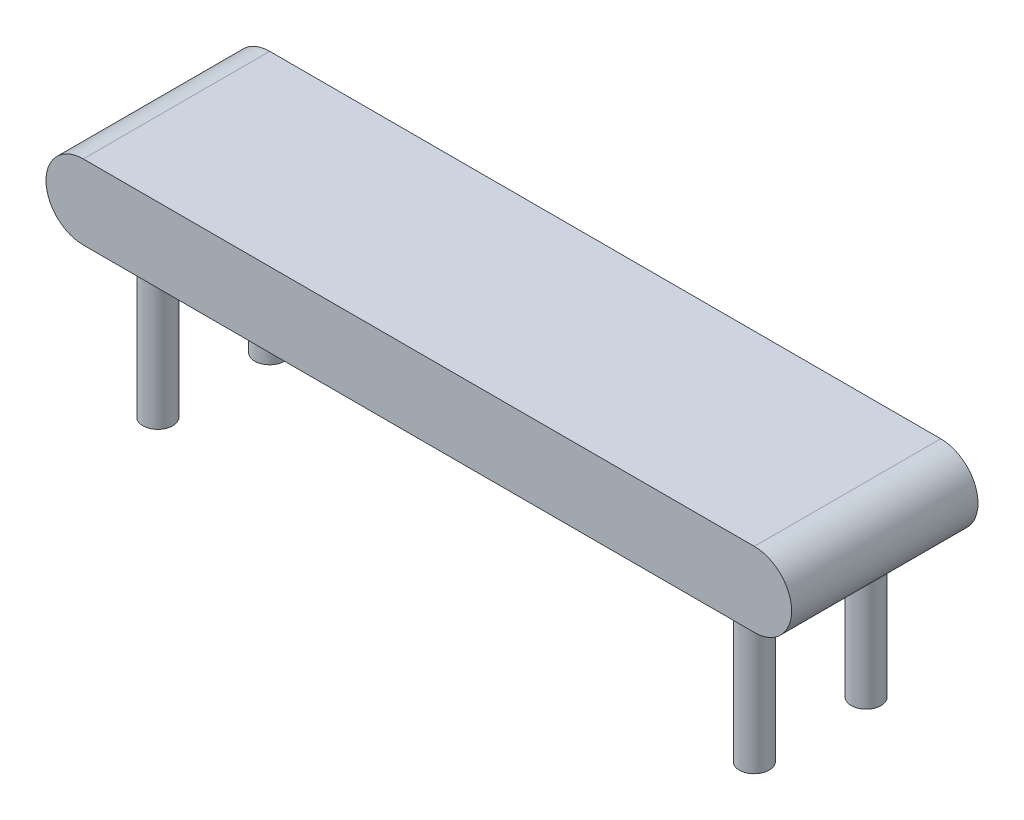
ISO-10303-21;
HEADER;
FILE_DESCRIPTION(('STEP AP214'),'2;1');
FILE_NAME('part.step','',(''),(''),'','','');
FILE_SCHEMA(('AUTOMOTIVE_DESIGN { 1 0 10303 214 1 1 1 1 }'));
ENDSEC;
DATA;
#1=APPLICATION_CONTEXT('core data for automotive mechanical design processes');
#2=APPLICATION_PROTOCOL_DEFINITION('international standard','automotive_design',2000,#1);
#3=PRODUCT_CONTEXT('',#1,'mechanical');
#4=PRODUCT('Part','Part','',(#3));
#5=PRODUCT_RELATED_PRODUCT_CATEGORY('part','',(#4));
#6=PRODUCT_DEFINITION_FORMATION('','',#4);
#7=PRODUCT_DEFINITION_CONTEXT('part definition',#1,'design');
#8=PRODUCT_DEFINITION('design','',#6,#7);
#9=PRODUCT_DEFINITION_SHAPE('','',#8);
#10=(LENGTH_UNIT() NAMED_UNIT(*) SI_UNIT(.MILLI.,.METRE.));
#11=(NAMED_UNIT(*) PLANE_ANGLE_UNIT() SI_UNIT($,.RADIAN.));
#12=(NAMED_UNIT(*) SI_UNIT($,.STERADIAN.) SOLID_ANGLE_UNIT());
#13=UNCERTAINTY_MEASURE_WITH_UNIT(LENGTH_MEASURE(1.E-05),#10,'distance_accuracy_value','');
#14=(GEOMETRIC_REPRESENTATION_CONTEXT(3) GLOBAL_UNCERTAINTY_ASSIGNED_CONTEXT((#13)) GLOBAL_UNIT_ASSIGNED_CONTEXT((#10,
#11,#12)) REPRESENTATION_CONTEXT('',''));
#15=CARTESIAN_POINT('',(0.,0.,0.));
#16=DIRECTION('',(0.,0.,1.));
#17=DIRECTION('',(1.,0.,0.));
#18=AXIS2_PLACEMENT_3D('',#15,#16,#17);
#19=CARTESIAN_POINT('',(-500.,100.,-125.));
#20=DIRECTION('',(0.,0.,1.));
#21=DIRECTION('',(1.,0.,0.));
#22=AXIS2_PLACEMENT_3D('',#19,#20,#21);
#23=PLANE('',#22);
#24=DIRECTION('',(-1.,0.,0.));
#25=VECTOR('',#24,1.);
#26=CARTESIAN_POINT('',(-500.,0.,-125.));
#27=LINE('',#26,#25);
#28=CARTESIAN_POINT('',(450.,0.,-125.));
#29=VERTEX_POINT('',#28);
#30=CARTESIAN_POINT('',(-450.,0.,-125.));
#31=VERTEX_POINT('',#30);
#32=EDGE_CURVE('E87',#29,#31,#27,.T.);
#33=ORIENTED_EDGE('',*,*,#32,.T.);
#34=CARTESIAN_POINT('',(-450.,50.,-125.));
#35=DIRECTION('',(0.,0.,1.));
#36=DIRECTION('',(1.,0.,0.));
#37=AXIS2_PLACEMENT_3D('',#34,#35,#36);
#38=CIRCLE('',#37,50.);
#39=CARTESIAN_POINT('',(-450.,100.,-125.));
#40=VERTEX_POINT('',#39);
#41=EDGE_CURVE('E74',#40,#31,#38,.T.);
#42=ORIENTED_EDGE('',*,*,#41,.F.);
#43=DIRECTION('',(-1.,0.,0.));
#44=VECTOR('',#43,1.);
#45=CARTESIAN_POINT('',(-500.,100.,-125.));
#46=LINE('',#45,#44);
#47=CARTESIAN_POINT('',(450.,100.,-125.));
#48=VERTEX_POINT('',#47);
#49=EDGE_CURVE('E42',#48,#40,#46,.T.);
#50=ORIENTED_EDGE('',*,*,#49,.F.);
#51=CARTESIAN_POINT('',(450.,50.,-125.));
#52=DIRECTION('',(0.,0.,1.));
#53=DIRECTION('',(1.,0.,0.));
#54=AXIS2_PLACEMENT_3D('',#51,#52,#53);
#55=CIRCLE('',#54,50.);
#56=EDGE_CURVE('E92',#48,#29,#55,.F.);
#57=ORIENTED_EDGE('',*,*,#56,.T.);
#58=EDGE_LOOP('',(#33,#42,#50,#57));
#59=FACE_BOUND('',#58,.T.);
#60=ADVANCED_FACE('F34',(#59),#23,.F.);
#61=CARTESIAN_POINT('',(-500.,100.,125.));
#62=DIRECTION('',(0.,0.,-1.));
#63=DIRECTION('',(-1.,0.,0.));
#64=AXIS2_PLACEMENT_3D('',#61,#62,#63);
#65=PLANE('',#64);
#66=CARTESIAN_POINT('',(-450.,50.,125.));
#67=DIRECTION('',(0.,0.,1.));
#68=DIRECTION('',(1.,0.,0.));
#69=AXIS2_PLACEMENT_3D('',#66,#67,#68);
#70=CIRCLE('',#69,50.);
#71=CARTESIAN_POINT('',(-450.,100.,125.));
#72=VERTEX_POINT('',#71);
#73=CARTESIAN_POINT('',(-450.,0.,125.));
#74=VERTEX_POINT('',#73);
#75=EDGE_CURVE('E50',#72,#74,#70,.T.);
#76=ORIENTED_EDGE('',*,*,#75,.T.);
#77=DIRECTION('',(1.,0.,0.));
#78=VECTOR('',#77,1.);
#79=CARTESIAN_POINT('',(-500.,0.,125.));
#80=LINE('',#79,#78);
#81=CARTESIAN_POINT('',(450.,0.,125.));
#82=VERTEX_POINT('',#81);
#83=EDGE_CURVE('E37',#74,#82,#80,.T.);
#84=ORIENTED_EDGE('',*,*,#83,.T.);
#85=CARTESIAN_POINT('',(450.,50.,125.));
#86=DIRECTION('',(0.,0.,1.));
#87=DIRECTION('',(1.,0.,0.));
#88=AXIS2_PLACEMENT_3D('',#85,#86,#87);
#89=CIRCLE('',#88,50.);
#90=CARTESIAN_POINT('',(450.,100.,125.));
#91=VERTEX_POINT('',#90);
#92=EDGE_CURVE('E88',#91,#82,#89,.F.);
#93=ORIENTED_EDGE('',*,*,#92,.F.);
#94=DIRECTION('',(1.,0.,0.));
#95=VECTOR('',#94,1.);
#96=CARTESIAN_POINT('',(-500.,100.,125.));
#97=LINE('',#96,#95);
#98=EDGE_CURVE('E11',#72,#91,#97,.T.);
#99=ORIENTED_EDGE('',*,*,#98,.F.);
#100=EDGE_LOOP('',(#76,#84,#93,#99));
#101=FACE_BOUND('',#100,.T.);
#102=ADVANCED_FACE('F163',(#101),#65,.F.);
#103=CARTESIAN_POINT('',(0.,100.,0.));
#104=DIRECTION('',(0.,-1.,0.));
#105=DIRECTION('',(0.,0.,-1.));
#106=AXIS2_PLACEMENT_3D('',#103,#104,#105);
#107=PLANE('',#106);
#108=ORIENTED_EDGE('',*,*,#98,.T.);
#109=DIRECTION('',(0.,0.,1.));
#110=VECTOR('',#109,1.);
#111=CARTESIAN_POINT('',(450.,100.,-125.));
#112=LINE('',#111,#110);
#113=EDGE_CURVE('E89',#48,#91,#112,.T.);
#114=ORIENTED_EDGE('',*,*,#113,.F.);
#115=ORIENTED_EDGE('',*,*,#49,.T.);
#116=DIRECTION('',(0.,0.,1.));
#117=VECTOR('',#116,1.);
#118=CARTESIAN_POINT('',(-450.,100.,-125.));
#119=LINE('',#118,#117);
#120=EDGE_CURVE('E78',#40,#72,#119,.T.);
#121=ORIENTED_EDGE('',*,*,#120,.T.);
#122=EDGE_LOOP('',(#108,#114,#115,#121));
#123=FACE_BOUND('',#122,.T.);
#124=ADVANCED_FACE('F140',(#123),#107,.F.);
#125=CARTESIAN_POINT('',(0.,0.,0.));
#126=DIRECTION('',(0.,-1.,0.));
#127=DIRECTION('',(0.,0.,-1.));
#128=AXIS2_PLACEMENT_3D('',#125,#126,#127);
#129=PLANE('',#128);
#130=CARTESIAN_POINT('',(-400.,0.,-75.));
#131=DIRECTION('',(0.,-1.,0.));
#132=DIRECTION('',(0.,0.,1.));
#133=AXIS2_PLACEMENT_3D('',#130,#131,#132);
#134=CIRCLE('',#133,20.);
#135=CARTESIAN_POINT('',(-400.,0.,-55.));
#136=VERTEX_POINT('',#135);
#137=EDGE_CURVE('E122',#136,#136,#134,.T.);
#138=ORIENTED_EDGE('',*,*,#137,.F.);
#139=EDGE_LOOP('',(#138));
#140=FACE_BOUND('',#139,.T.);
#141=CARTESIAN_POINT('',(400.,0.,-75.));
#142=DIRECTION('',(0.,-1.,0.));
#143=DIRECTION('',(0.,0.,-1.));
#144=AXIS2_PLACEMENT_3D('',#141,#142,#143);
#145=CIRCLE('',#144,20.);
#146=CARTESIAN_POINT('',(400.,0.,-95.));
#147=VERTEX_POINT('',#146);
#148=EDGE_CURVE('E116',#147,#147,#145,.T.);
#149=ORIENTED_EDGE('',*,*,#148,.F.);
#150=EDGE_LOOP('',(#149));
#151=FACE_BOUND('',#150,.T.);
#152=CARTESIAN_POINT('',(400.,0.,75.));
#153=DIRECTION('',(0.,-1.,0.));
#154=DIRECTION('',(0.,0.,1.));
#155=AXIS2_PLACEMENT_3D('',#152,#153,#154);
#156=CIRCLE('',#155,20.);
#157=CARTESIAN_POINT('',(400.,0.,95.));
#158=VERTEX_POINT('',#157);
#159=EDGE_CURVE('E110',#158,#158,#156,.T.);
#160=ORIENTED_EDGE('',*,*,#159,.F.);
#161=EDGE_LOOP('',(#160));
#162=FACE_BOUND('',#161,.T.);
#163=CARTESIAN_POINT('',(-400.,0.,75.));
#164=DIRECTION('',(0.,-1.,0.));
#165=DIRECTION('',(0.,0.,-1.));
#166=AXIS2_PLACEMENT_3D('',#163,#164,#165);
#167=CIRCLE('',#166,20.);
#168=CARTESIAN_POINT('',(-400.,0.,55.));
#169=VERTEX_POINT('',#168);
#170=EDGE_CURVE('E104',#169,#169,#167,.T.);
#171=ORIENTED_EDGE('',*,*,#170,.F.);
#172=EDGE_LOOP('',(#171));
#173=FACE_BOUND('',#172,.T.);
#174=DIRECTION('',(0.,0.,1.));
#175=VECTOR('',#174,1.);
#176=CARTESIAN_POINT('',(-450.,0.,-125.));
#177=LINE('',#176,#175);
#178=EDGE_CURVE('E77',#31,#74,#177,.T.);
#179=ORIENTED_EDGE('',*,*,#178,.F.);
#180=ORIENTED_EDGE('',*,*,#32,.F.);
#181=DIRECTION('',(0.,0.,1.));
#182=VECTOR('',#181,1.);
#183=CARTESIAN_POINT('',(450.,0.,-125.));
#184=LINE('',#183,#182);
#185=EDGE_CURVE('E96',#29,#82,#184,.T.);
#186=ORIENTED_EDGE('',*,*,#185,.T.);
#187=ORIENTED_EDGE('',*,*,#83,.F.);
#188=EDGE_LOOP('',(#179,#180,#186,#187));
#189=FACE_BOUND('',#188,.T.);
#190=ADVANCED_FACE('F85',(#140,#151,#162,#173,#189),#129,.T.);
#191=CARTESIAN_POINT('',(450.,50.,-125.));
#192=DIRECTION('',(0.,0.,1.));
#193=DIRECTION('',(1.,0.,0.));
#194=AXIS2_PLACEMENT_3D('',#191,#192,#193);
#195=CYLINDRICAL_SURFACE('',#194,50.);
#196=ORIENTED_EDGE('',*,*,#92,.T.);
#197=ORIENTED_EDGE('',*,*,#185,.F.);
#198=ORIENTED_EDGE('',*,*,#56,.F.);
#199=ORIENTED_EDGE('',*,*,#113,.T.);
#200=EDGE_LOOP('',(#196,#197,#198,#199));
#201=FACE_BOUND('',#200,.T.);
#202=ADVANCED_FACE('F139',(#201),#195,.T.);
#203=CARTESIAN_POINT('',(-450.,50.,-125.));
#204=DIRECTION('',(0.,0.,1.));
#205=DIRECTION('',(1.,0.,0.));
#206=AXIS2_PLACEMENT_3D('',#203,#204,#205);
#207=CYLINDRICAL_SURFACE('',#206,50.);
#208=ORIENTED_EDGE('',*,*,#75,.F.);
#209=ORIENTED_EDGE('',*,*,#120,.F.);
#210=ORIENTED_EDGE('',*,*,#41,.T.);
#211=ORIENTED_EDGE('',*,*,#178,.T.);
#212=EDGE_LOOP('',(#208,#209,#210,#211));
#213=FACE_BOUND('',#212,.T.);
#214=ADVANCED_FACE('F76',(#213),#207,.T.);
#215=CARTESIAN_POINT('',(-400.,-200.,75.));
#216=DIRECTION('',(0.,1.,0.));
#217=DIRECTION('',(0.,0.,1.));
#218=AXIS2_PLACEMENT_3D('',#215,#216,#217);
#219=CYLINDRICAL_SURFACE('',#218,20.);
#220=CARTESIAN_POINT('',(-400.,-200.,75.));
#221=DIRECTION('',(0.,-1.,0.));
#222=DIRECTION('',(0.,0.,-1.));
#223=AXIS2_PLACEMENT_3D('',#220,#221,#222);
#224=CIRCLE('',#223,20.);
#225=CARTESIAN_POINT('',(-400.,-200.,55.));
#226=VERTEX_POINT('',#225);
#227=EDGE_CURVE('E102',#226,#226,#224,.T.);
#228=ORIENTED_EDGE('',*,*,#227,.F.);
#229=EDGE_LOOP('',(#228));
#230=FACE_BOUND('',#229,.T.);
#231=ORIENTED_EDGE('',*,*,#170,.T.);
#232=EDGE_LOOP('',(#231));
#233=FACE_BOUND('',#232,.T.);
#234=ADVANCED_FACE('F148',(#230,#233),#219,.T.);
#235=CARTESIAN_POINT('',(-400.,-200.,75.));
#236=DIRECTION('',(0.,-1.,0.));
#237=DIRECTION('',(0.,0.,-1.));
#238=AXIS2_PLACEMENT_3D('',#235,#236,#237);
#239=PLANE('',#238);
#240=ORIENTED_EDGE('',*,*,#227,.T.);
#241=EDGE_LOOP('',(#240));
#242=FACE_BOUND('',#241,.T.);
#243=ADVANCED_FACE('F150',(#242),#239,.T.);
#244=CARTESIAN_POINT('',(400.,-200.,75.));
#245=DIRECTION('',(0.,1.,0.));
#246=DIRECTION('',(0.,0.,1.));
#247=AXIS2_PLACEMENT_3D('',#244,#245,#246);
#248=CYLINDRICAL_SURFACE('',#247,20.);
#249=CARTESIAN_POINT('',(400.,-200.,75.));
#250=DIRECTION('',(0.,-1.,0.));
#251=DIRECTION('',(0.,0.,1.));
#252=AXIS2_PLACEMENT_3D('',#249,#250,#251);
#253=CIRCLE('',#252,20.);
#254=CARTESIAN_POINT('',(400.,-200.,95.));
#255=VERTEX_POINT('',#254);
#256=EDGE_CURVE('E107',#255,#255,#253,.T.);
#257=ORIENTED_EDGE('',*,*,#256,.F.);
#258=EDGE_LOOP('',(#257));
#259=FACE_BOUND('',#258,.T.);
#260=ORIENTED_EDGE('',*,*,#159,.T.);
#261=EDGE_LOOP('',(#260));
#262=FACE_BOUND('',#261,.T.);
#263=ADVANCED_FACE('F157',(#259,#262),#248,.T.);
#264=CARTESIAN_POINT('',(400.,-200.,75.));
#265=DIRECTION('',(0.,1.,0.));
#266=DIRECTION('',(0.,0.,1.));
#267=AXIS2_PLACEMENT_3D('',#264,#265,#266);
#268=PLANE('',#267);
#269=ORIENTED_EDGE('',*,*,#256,.T.);
#270=EDGE_LOOP('',(#269));
#271=FACE_BOUND('',#270,.T.);
#272=ADVANCED_FACE('F212',(#271),#268,.F.);
#273=CARTESIAN_POINT('',(400.,-200.,-75.));
#274=DIRECTION('',(0.,1.,0.));
#275=DIRECTION('',(0.,0.,1.));
#276=AXIS2_PLACEMENT_3D('',#273,#274,#275);
#277=CYLINDRICAL_SURFACE('',#276,20.);
#278=CARTESIAN_POINT('',(400.,-200.,-75.));
#279=DIRECTION('',(0.,-1.,0.));
#280=DIRECTION('',(0.,0.,-1.));
#281=AXIS2_PLACEMENT_3D('',#278,#279,#280);
#282=CIRCLE('',#281,20.);
#283=CARTESIAN_POINT('',(400.,-200.,-95.));
#284=VERTEX_POINT('',#283);
#285=EDGE_CURVE('E113',#284,#284,#282,.T.);
#286=ORIENTED_EDGE('',*,*,#285,.F.);
#287=EDGE_LOOP('',(#286));
#288=FACE_BOUND('',#287,.T.);
#289=ORIENTED_EDGE('',*,*,#148,.T.);
#290=EDGE_LOOP('',(#289));
#291=FACE_BOUND('',#290,.T.);
#292=ADVANCED_FACE('F222',(#288,#291),#277,.T.);
#293=CARTESIAN_POINT('',(400.,-200.,-75.));
#294=DIRECTION('',(0.,-1.,0.));
#295=DIRECTION('',(0.,0.,-1.));
#296=AXIS2_PLACEMENT_3D('',#293,#294,#295);
#297=PLANE('',#296);
#298=ORIENTED_EDGE('',*,*,#285,.T.);
#299=EDGE_LOOP('',(#298));
#300=FACE_BOUND('',#299,.T.);
#301=ADVANCED_FACE('F133',(#300),#297,.T.);
#302=CARTESIAN_POINT('',(-400.,-200.,-75.));
#303=DIRECTION('',(0.,1.,0.));
#304=DIRECTION('',(0.,0.,1.));
#305=AXIS2_PLACEMENT_3D('',#302,#303,#304);
#306=CYLINDRICAL_SURFACE('',#305,20.);
#307=CARTESIAN_POINT('',(-400.,-200.,-75.));
#308=DIRECTION('',(0.,-1.,0.));
#309=DIRECTION('',(0.,0.,1.));
#310=AXIS2_PLACEMENT_3D('',#307,#308,#309);
#311=CIRCLE('',#310,20.);
#312=CARTESIAN_POINT('',(-400.,-200.,-55.));
#313=VERTEX_POINT('',#312);
#314=EDGE_CURVE('E119',#313,#313,#311,.T.);
#315=ORIENTED_EDGE('',*,*,#314,.F.);
#316=EDGE_LOOP('',(#315));
#317=FACE_BOUND('',#316,.T.);
#318=ORIENTED_EDGE('',*,*,#137,.T.);
#319=EDGE_LOOP('',(#318));
#320=FACE_BOUND('',#319,.T.);
#321=ADVANCED_FACE('F130',(#317,#320),#306,.T.);
#322=CARTESIAN_POINT('',(-400.,-200.,-75.));
#323=DIRECTION('',(0.,1.,0.));
#324=DIRECTION('',(0.,0.,1.));
#325=AXIS2_PLACEMENT_3D('',#322,#323,#324);
#326=PLANE('',#325);
#327=ORIENTED_EDGE('',*,*,#314,.T.);
#328=EDGE_LOOP('',(#327));
#329=FACE_BOUND('',#328,.T.);
#330=ADVANCED_FACE('F128',(#329),#326,.F.);
#331=CLOSED_SHELL('',(#60,#102,#124,#190,#202,#214,#234,#243,#263,#272,#292,#301,#321,#330));
#332=MANIFOLD_SOLID_BREP('B2',#331);
#333=ADVANCED_BREP_SHAPE_REPRESENTATION('',(#18,#332),#14);
#334=SHAPE_DEFINITION_REPRESENTATION(#9,#333);
ENDSEC;
END-ISO-10303-21;
